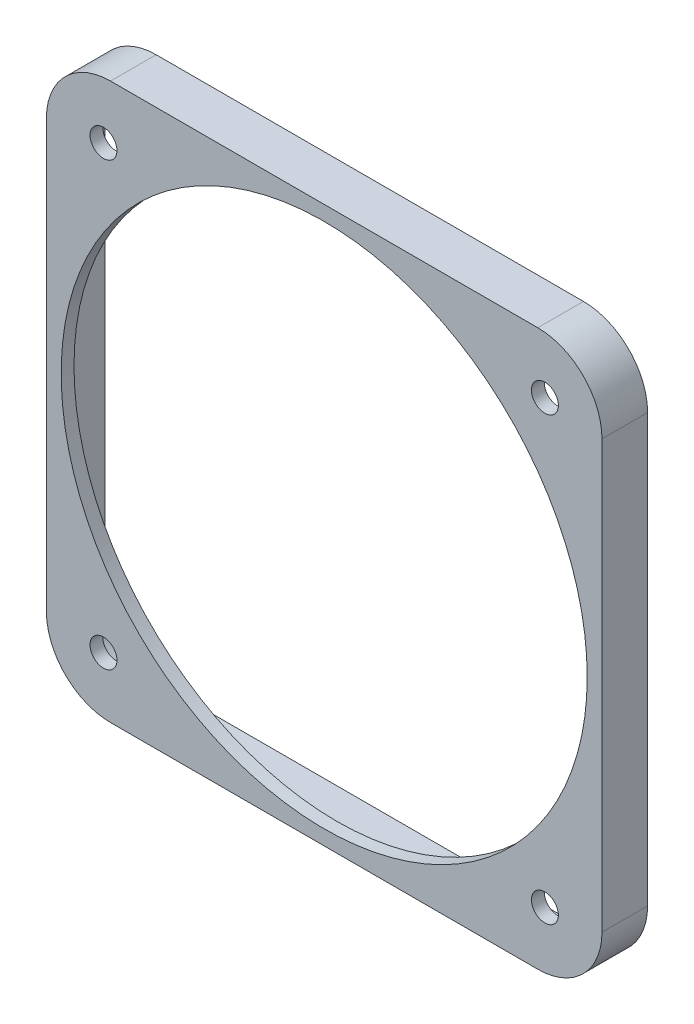
ISO-10303-21;
HEADER;
FILE_DESCRIPTION(('STEP AP214'),'2;1');
FILE_NAME('part.step','',(''),(''),'','','');
FILE_SCHEMA(('AUTOMOTIVE_DESIGN { 1 0 10303 214 1 1 1 1 }'));
ENDSEC;
DATA;
#1=APPLICATION_CONTEXT('core data for automotive mechanical design processes');
#2=APPLICATION_PROTOCOL_DEFINITION('international standard','automotive_design',2000,#1);
#3=PRODUCT_CONTEXT('',#1,'mechanical');
#4=PRODUCT('Part','Part','',(#3));
#5=PRODUCT_RELATED_PRODUCT_CATEGORY('part','',(#4));
#6=PRODUCT_DEFINITION_FORMATION('','',#4);
#7=PRODUCT_DEFINITION_CONTEXT('part definition',#1,'design');
#8=PRODUCT_DEFINITION('design','',#6,#7);
#9=PRODUCT_DEFINITION_SHAPE('','',#8);
#10=(LENGTH_UNIT() NAMED_UNIT(*) SI_UNIT(.MILLI.,.METRE.));
#11=(NAMED_UNIT(*) PLANE_ANGLE_UNIT() SI_UNIT($,.RADIAN.));
#12=(NAMED_UNIT(*) SI_UNIT($,.STERADIAN.) SOLID_ANGLE_UNIT());
#13=UNCERTAINTY_MEASURE_WITH_UNIT(LENGTH_MEASURE(1.E-05),#10,'distance_accuracy_value','');
#14=(GEOMETRIC_REPRESENTATION_CONTEXT(3) GLOBAL_UNCERTAINTY_ASSIGNED_CONTEXT((#13)) GLOBAL_UNIT_ASSIGNED_CONTEXT((#10,
#11,#12)) REPRESENTATION_CONTEXT('',''));
#15=CARTESIAN_POINT('',(0.,0.,0.));
#16=DIRECTION('',(0.,0.,1.));
#17=DIRECTION('',(1.,0.,0.));
#18=AXIS2_PLACEMENT_3D('',#15,#16,#17);
#19=CARTESIAN_POINT('',(0.,0.,0.));
#20=DIRECTION('',(0.,0.,-1.));
#21=DIRECTION('',(-1.,0.,0.));
#22=AXIS2_PLACEMENT_3D('',#19,#20,#21);
#23=PLANE('',#22);
#24=DIRECTION('',(0.,1.,0.));
#25=VECTOR('',#24,1.);
#26=CARTESIAN_POINT('',(54.991,-54.991,0.));
#27=LINE('',#26,#25);
#28=CARTESIAN_POINT('',(54.991,-42.291,0.));
#29=VERTEX_POINT('',#28);
#30=CARTESIAN_POINT('',(54.991,42.291,0.));
#31=VERTEX_POINT('',#30);
#32=EDGE_CURVE('E198',#29,#31,#27,.T.);
#33=ORIENTED_EDGE('',*,*,#32,.F.);
#34=CARTESIAN_POINT('',(42.291,-42.291,0.));
#35=DIRECTION('',(0.,0.,-1.));
#36=DIRECTION('',(-1.,0.,0.));
#37=AXIS2_PLACEMENT_3D('',#34,#35,#36);
#38=CIRCLE('',#37,12.7);
#39=CARTESIAN_POINT('',(42.291,-54.991,0.));
#40=VERTEX_POINT('',#39);
#41=EDGE_CURVE('E253',#29,#40,#38,.T.);
#42=ORIENTED_EDGE('',*,*,#41,.T.);
#43=DIRECTION('',(1.,0.,0.));
#44=VECTOR('',#43,1.);
#45=CARTESIAN_POINT('',(-54.991,-54.991,0.));
#46=LINE('',#45,#44);
#47=CARTESIAN_POINT('',(-42.291,-54.991,0.));
#48=VERTEX_POINT('',#47);
#49=EDGE_CURVE('E225',#48,#40,#46,.T.);
#50=ORIENTED_EDGE('',*,*,#49,.F.);
#51=CARTESIAN_POINT('',(-42.291,-42.291,0.));
#52=DIRECTION('',(0.,0.,-1.));
#53=DIRECTION('',(-1.,0.,0.));
#54=AXIS2_PLACEMENT_3D('',#51,#52,#53);
#55=CIRCLE('',#54,12.7);
#56=CARTESIAN_POINT('',(-54.991,-42.291,0.));
#57=VERTEX_POINT('',#56);
#58=EDGE_CURVE('E251',#48,#57,#55,.T.);
#59=ORIENTED_EDGE('',*,*,#58,.T.);
#60=DIRECTION('',(0.,-1.,0.));
#61=VECTOR('',#60,1.);
#62=CARTESIAN_POINT('',(-54.991,-54.991,0.));
#63=LINE('',#62,#61);
#64=CARTESIAN_POINT('',(-54.991,42.291,0.));
#65=VERTEX_POINT('',#64);
#66=EDGE_CURVE('E239',#65,#57,#63,.T.);
#67=ORIENTED_EDGE('',*,*,#66,.F.);
#68=CARTESIAN_POINT('',(-42.291,42.291,0.));
#69=DIRECTION('',(0.,0.,-1.));
#70=DIRECTION('',(-1.,0.,0.));
#71=AXIS2_PLACEMENT_3D('',#68,#69,#70);
#72=CIRCLE('',#71,12.7);
#73=CARTESIAN_POINT('',(-42.291,54.991,0.));
#74=VERTEX_POINT('',#73);
#75=EDGE_CURVE('E249',#65,#74,#72,.T.);
#76=ORIENTED_EDGE('',*,*,#75,.T.);
#77=DIRECTION('',(-1.,0.,0.));
#78=VECTOR('',#77,1.);
#79=CARTESIAN_POINT('',(-54.991,54.991,0.));
#80=LINE('',#79,#78);
#81=CARTESIAN_POINT('',(42.291,54.991,0.));
#82=VERTEX_POINT('',#81);
#83=EDGE_CURVE('E236',#82,#74,#80,.T.);
#84=ORIENTED_EDGE('',*,*,#83,.F.);
#85=CARTESIAN_POINT('',(42.291,42.291,0.));
#86=DIRECTION('',(0.,0.,-1.));
#87=DIRECTION('',(-1.,0.,0.));
#88=AXIS2_PLACEMENT_3D('',#85,#86,#87);
#89=CIRCLE('',#88,12.7);
#90=EDGE_CURVE('E247',#82,#31,#89,.T.);
#91=ORIENTED_EDGE('',*,*,#90,.T.);
#92=EDGE_LOOP('',(#33,#42,#50,#59,#67,#76,#84,#91));
#93=FACE_BOUND('',#92,.T.);
#94=CARTESIAN_POINT('',(42.291,-42.291,0.));
#95=DIRECTION('',(0.,0.,-1.));
#96=DIRECTION('',(-1.,0.,0.));
#97=AXIS2_PLACEMENT_3D('',#94,#95,#96);
#98=CIRCLE('',#97,10.16);
#99=CARTESIAN_POINT('',(52.451,-42.291,0.));
#100=VERTEX_POINT('',#99);
#101=CARTESIAN_POINT('',(42.291,-52.451,0.));
#102=VERTEX_POINT('',#101);
#103=EDGE_CURVE('E205',#100,#102,#98,.T.);
#104=ORIENTED_EDGE('',*,*,#103,.F.);
#105=DIRECTION('',(0.,1.,0.));
#106=VECTOR('',#105,1.);
#107=CARTESIAN_POINT('',(52.451,0.,0.));
#108=LINE('',#107,#106);
#109=CARTESIAN_POINT('',(52.451,42.291,0.));
#110=VERTEX_POINT('',#109);
#111=EDGE_CURVE('E207',#100,#110,#108,.T.);
#112=ORIENTED_EDGE('',*,*,#111,.T.);
#113=CARTESIAN_POINT('',(42.291,42.291,0.));
#114=DIRECTION('',(0.,0.,-1.));
#115=DIRECTION('',(-1.,0.,0.));
#116=AXIS2_PLACEMENT_3D('',#113,#114,#115);
#117=CIRCLE('',#116,10.16);
#118=CARTESIAN_POINT('',(42.291,52.451,0.));
#119=VERTEX_POINT('',#118);
#120=EDGE_CURVE('E160',#119,#110,#117,.T.);
#121=ORIENTED_EDGE('',*,*,#120,.F.);
#122=DIRECTION('',(-1.,0.,0.));
#123=VECTOR('',#122,1.);
#124=CARTESIAN_POINT('',(0.,52.451,0.));
#125=LINE('',#124,#123);
#126=CARTESIAN_POINT('',(-42.291,52.451,0.));
#127=VERTEX_POINT('',#126);
#128=EDGE_CURVE('E53',#119,#127,#125,.T.);
#129=ORIENTED_EDGE('',*,*,#128,.T.);
#130=CARTESIAN_POINT('',(-42.291,42.291,0.));
#131=DIRECTION('',(0.,0.,-1.));
#132=DIRECTION('',(-1.,0.,0.));
#133=AXIS2_PLACEMENT_3D('',#130,#131,#132);
#134=CIRCLE('',#133,10.16);
#135=CARTESIAN_POINT('',(-52.451,42.291,0.));
#136=VERTEX_POINT('',#135);
#137=EDGE_CURVE('E215',#136,#127,#134,.T.);
#138=ORIENTED_EDGE('',*,*,#137,.F.);
#139=DIRECTION('',(0.,-1.,0.));
#140=VECTOR('',#139,1.);
#141=CARTESIAN_POINT('',(-52.451,0.,0.));
#142=LINE('',#141,#140);
#143=CARTESIAN_POINT('',(-52.451,-42.291,0.));
#144=VERTEX_POINT('',#143);
#145=EDGE_CURVE('E213',#136,#144,#142,.T.);
#146=ORIENTED_EDGE('',*,*,#145,.T.);
#147=CARTESIAN_POINT('',(-42.291,-42.291,0.));
#148=DIRECTION('',(0.,0.,-1.));
#149=DIRECTION('',(-1.,0.,0.));
#150=AXIS2_PLACEMENT_3D('',#147,#148,#149);
#151=CIRCLE('',#150,10.16);
#152=CARTESIAN_POINT('',(-42.291,-52.451,0.));
#153=VERTEX_POINT('',#152);
#154=EDGE_CURVE('E210',#153,#144,#151,.T.);
#155=ORIENTED_EDGE('',*,*,#154,.F.);
#156=DIRECTION('',(1.,0.,0.));
#157=VECTOR('',#156,1.);
#158=CARTESIAN_POINT('',(0.,-52.451,0.));
#159=LINE('',#158,#157);
#160=EDGE_CURVE('E174',#153,#102,#159,.T.);
#161=ORIENTED_EDGE('',*,*,#160,.T.);
#162=EDGE_LOOP('',(#104,#112,#121,#129,#138,#146,#155,#161));
#163=FACE_BOUND('',#162,.T.);
#164=ADVANCED_FACE('F36',(#93,#163),#23,.T.);
#165=CARTESIAN_POINT('',(54.991,-54.991,9.0297));
#166=DIRECTION('',(-1.,0.,0.));
#167=DIRECTION('',(0.,0.,1.));
#168=AXIS2_PLACEMENT_3D('',#165,#166,#167);
#169=PLANE('',#168);
#170=DIRECTION('',(0.,1.,0.));
#171=VECTOR('',#170,1.);
#172=CARTESIAN_POINT('',(54.991,-54.991,9.0297));
#173=LINE('',#172,#171);
#174=CARTESIAN_POINT('',(54.991,-42.291,9.0297));
#175=VERTEX_POINT('',#174);
#176=CARTESIAN_POINT('',(54.991,42.291,9.0297));
#177=VERTEX_POINT('',#176);
#178=EDGE_CURVE('E221',#175,#177,#173,.T.);
#179=ORIENTED_EDGE('',*,*,#178,.F.);
#180=DIRECTION('',(0.,0.,-1.));
#181=VECTOR('',#180,1.);
#182=CARTESIAN_POINT('',(54.991,-42.291,9.0297));
#183=LINE('',#182,#181);
#184=EDGE_CURVE('E244',#175,#29,#183,.T.);
#185=ORIENTED_EDGE('',*,*,#184,.T.);
#186=ORIENTED_EDGE('',*,*,#32,.T.);
#187=DIRECTION('',(0.,0.,-1.));
#188=VECTOR('',#187,1.);
#189=CARTESIAN_POINT('',(54.991,42.291,9.0297));
#190=LINE('',#189,#188);
#191=EDGE_CURVE('E233',#31,#177,#190,.F.);
#192=ORIENTED_EDGE('',*,*,#191,.T.);
#193=EDGE_LOOP('',(#179,#185,#186,#192));
#194=FACE_BOUND('',#193,.T.);
#195=ADVANCED_FACE('F353',(#194),#169,.F.);
#196=CARTESIAN_POINT('',(-54.991,54.991,9.0297));
#197=DIRECTION('',(0.,-1.,0.));
#198=DIRECTION('',(0.,0.,-1.));
#199=AXIS2_PLACEMENT_3D('',#196,#197,#198);
#200=PLANE('',#199);
#201=ORIENTED_EDGE('',*,*,#83,.T.);
#202=DIRECTION('',(0.,0.,-1.));
#203=VECTOR('',#202,1.);
#204=CARTESIAN_POINT('',(-42.291,54.991,9.0297));
#205=LINE('',#204,#203);
#206=CARTESIAN_POINT('',(-42.291,54.991,9.0297));
#207=VERTEX_POINT('',#206);
#208=EDGE_CURVE('E11',#74,#207,#205,.F.);
#209=ORIENTED_EDGE('',*,*,#208,.T.);
#210=DIRECTION('',(-1.,0.,0.));
#211=VECTOR('',#210,1.);
#212=CARTESIAN_POINT('',(-54.991,54.991,9.0297));
#213=LINE('',#212,#211);
#214=CARTESIAN_POINT('',(42.291,54.991,9.0297));
#215=VERTEX_POINT('',#214);
#216=EDGE_CURVE('E224',#215,#207,#213,.T.);
#217=ORIENTED_EDGE('',*,*,#216,.F.);
#218=DIRECTION('',(0.,0.,-1.));
#219=VECTOR('',#218,1.);
#220=CARTESIAN_POINT('',(42.291,54.991,9.0297));
#221=LINE('',#220,#219);
#222=EDGE_CURVE('E45',#215,#82,#221,.T.);
#223=ORIENTED_EDGE('',*,*,#222,.T.);
#224=EDGE_LOOP('',(#201,#209,#217,#223));
#225=FACE_BOUND('',#224,.T.);
#226=ADVANCED_FACE('F359',(#225),#200,.F.);
#227=CARTESIAN_POINT('',(-54.991,-54.991,9.0297));
#228=DIRECTION('',(1.,0.,0.));
#229=DIRECTION('',(0.,0.,-1.));
#230=AXIS2_PLACEMENT_3D('',#227,#228,#229);
#231=PLANE('',#230);
#232=ORIENTED_EDGE('',*,*,#66,.T.);
#233=DIRECTION('',(0.,0.,-1.));
#234=VECTOR('',#233,1.);
#235=CARTESIAN_POINT('',(-54.991,-42.291,9.0297));
#236=LINE('',#235,#234);
#237=CARTESIAN_POINT('',(-54.991,-42.291,9.0297));
#238=VERTEX_POINT('',#237);
#239=EDGE_CURVE('E61',#57,#238,#236,.F.);
#240=ORIENTED_EDGE('',*,*,#239,.T.);
#241=DIRECTION('',(0.,-1.,0.));
#242=VECTOR('',#241,1.);
#243=CARTESIAN_POINT('',(-54.991,-54.991,9.0297));
#244=LINE('',#243,#242);
#245=CARTESIAN_POINT('',(-54.991,42.291,9.0297));
#246=VERTEX_POINT('',#245);
#247=EDGE_CURVE('E228',#246,#238,#244,.T.);
#248=ORIENTED_EDGE('',*,*,#247,.F.);
#249=DIRECTION('',(0.,0.,-1.));
#250=VECTOR('',#249,1.);
#251=CARTESIAN_POINT('',(-54.991,42.291,9.0297));
#252=LINE('',#251,#250);
#253=EDGE_CURVE('E268',#246,#65,#252,.T.);
#254=ORIENTED_EDGE('',*,*,#253,.T.);
#255=EDGE_LOOP('',(#232,#240,#248,#254));
#256=FACE_BOUND('',#255,.T.);
#257=ADVANCED_FACE('F370',(#256),#231,.F.);
#258=CARTESIAN_POINT('',(-54.991,-54.991,9.0297));
#259=DIRECTION('',(0.,1.,0.));
#260=DIRECTION('',(0.,0.,1.));
#261=AXIS2_PLACEMENT_3D('',#258,#259,#260);
#262=PLANE('',#261);
#263=ORIENTED_EDGE('',*,*,#49,.T.);
#264=DIRECTION('',(0.,0.,-1.));
#265=VECTOR('',#264,1.);
#266=CARTESIAN_POINT('',(42.291,-54.991,9.0297));
#267=LINE('',#266,#265);
#268=CARTESIAN_POINT('',(42.291,-54.991,9.0297));
#269=VERTEX_POINT('',#268);
#270=EDGE_CURVE('E258',#40,#269,#267,.F.);
#271=ORIENTED_EDGE('',*,*,#270,.T.);
#272=DIRECTION('',(1.,0.,0.));
#273=VECTOR('',#272,1.);
#274=CARTESIAN_POINT('',(-54.991,-54.991,9.0297));
#275=LINE('',#274,#273);
#276=CARTESIAN_POINT('',(-42.291,-54.991,9.0297));
#277=VERTEX_POINT('',#276);
#278=EDGE_CURVE('E230',#277,#269,#275,.T.);
#279=ORIENTED_EDGE('',*,*,#278,.F.);
#280=DIRECTION('',(0.,0.,-1.));
#281=VECTOR('',#280,1.);
#282=CARTESIAN_POINT('',(-42.291,-54.991,9.0297));
#283=LINE('',#282,#281);
#284=EDGE_CURVE('E255',#277,#48,#283,.T.);
#285=ORIENTED_EDGE('',*,*,#284,.T.);
#286=EDGE_LOOP('',(#263,#271,#279,#285));
#287=FACE_BOUND('',#286,.T.);
#288=ADVANCED_FACE('F367',(#287),#262,.F.);
#289=CARTESIAN_POINT('',(0.,0.,9.0297));
#290=DIRECTION('',(0.,0.,-1.));
#291=DIRECTION('',(-1.,0.,0.));
#292=AXIS2_PLACEMENT_3D('',#289,#290,#291);
#293=PLANE('',#292);
#294=CARTESIAN_POINT('',(43.688,-43.688,9.0297));
#295=DIRECTION('',(0.,0.,1.));
#296=DIRECTION('',(1.,0.,0.));
#297=AXIS2_PLACEMENT_3D('',#294,#295,#296);
#298=CIRCLE('',#297,2.667);
#299=CARTESIAN_POINT('',(46.355,-43.688,9.0297));
#300=VERTEX_POINT('',#299);
#301=EDGE_CURVE('E319',#300,#300,#298,.T.);
#302=ORIENTED_EDGE('',*,*,#301,.F.);
#303=EDGE_LOOP('',(#302));
#304=FACE_BOUND('',#303,.T.);
#305=CARTESIAN_POINT('',(-43.688,-43.688,9.0297));
#306=DIRECTION('',(0.,0.,1.));
#307=DIRECTION('',(1.,0.,0.));
#308=AXIS2_PLACEMENT_3D('',#305,#306,#307);
#309=CIRCLE('',#308,2.667);
#310=CARTESIAN_POINT('',(-41.021,-43.688,9.0297));
#311=VERTEX_POINT('',#310);
#312=EDGE_CURVE('E419',#311,#311,#309,.T.);
#313=ORIENTED_EDGE('',*,*,#312,.F.);
#314=EDGE_LOOP('',(#313));
#315=FACE_BOUND('',#314,.T.);
#316=CARTESIAN_POINT('',(-43.688,43.688,9.0297));
#317=DIRECTION('',(0.,0.,1.));
#318=DIRECTION('',(1.,0.,0.));
#319=AXIS2_PLACEMENT_3D('',#316,#317,#318);
#320=CIRCLE('',#319,2.667);
#321=CARTESIAN_POINT('',(-41.021,43.688,9.0297));
#322=VERTEX_POINT('',#321);
#323=EDGE_CURVE('E316',#322,#322,#320,.T.);
#324=ORIENTED_EDGE('',*,*,#323,.F.);
#325=EDGE_LOOP('',(#324));
#326=FACE_BOUND('',#325,.T.);
#327=CARTESIAN_POINT('',(43.688,43.688,9.0297));
#328=DIRECTION('',(0.,0.,1.));
#329=DIRECTION('',(1.,0.,0.));
#330=AXIS2_PLACEMENT_3D('',#327,#328,#329);
#331=CIRCLE('',#330,2.667);
#332=CARTESIAN_POINT('',(46.355,43.688,9.0297));
#333=VERTEX_POINT('',#332);
#334=EDGE_CURVE('E313',#333,#333,#331,.T.);
#335=ORIENTED_EDGE('',*,*,#334,.F.);
#336=EDGE_LOOP('',(#335));
#337=FACE_BOUND('',#336,.T.);
#338=CARTESIAN_POINT('',(0.,0.,9.0297));
#339=DIRECTION('',(0.,0.,1.));
#340=DIRECTION('',(1.,0.,0.));
#341=AXIS2_PLACEMENT_3D('',#338,#339,#340);
#342=CIRCLE('',#341,52.07);
#343=CARTESIAN_POINT('',(52.07,0.,9.0297));
#344=VERTEX_POINT('',#343);
#345=EDGE_CURVE('E278',#344,#344,#342,.T.);
#346=ORIENTED_EDGE('',*,*,#345,.F.);
#347=EDGE_LOOP('',(#346));
#348=FACE_BOUND('',#347,.T.);
#349=ORIENTED_EDGE('',*,*,#278,.T.);
#350=CARTESIAN_POINT('',(42.291,-42.291,9.0297));
#351=DIRECTION('',(0.,0.,-1.));
#352=DIRECTION('',(-1.,0.,0.));
#353=AXIS2_PLACEMENT_3D('',#350,#351,#352);
#354=CIRCLE('',#353,12.7);
#355=EDGE_CURVE('E266',#269,#175,#354,.F.);
#356=ORIENTED_EDGE('',*,*,#355,.T.);
#357=ORIENTED_EDGE('',*,*,#178,.T.);
#358=CARTESIAN_POINT('',(42.291,42.291,9.0297));
#359=DIRECTION('',(0.,0.,-1.));
#360=DIRECTION('',(-1.,0.,0.));
#361=AXIS2_PLACEMENT_3D('',#358,#359,#360);
#362=CIRCLE('',#361,12.7);
#363=EDGE_CURVE('E260',#177,#215,#362,.F.);
#364=ORIENTED_EDGE('',*,*,#363,.T.);
#365=ORIENTED_EDGE('',*,*,#216,.T.);
#366=CARTESIAN_POINT('',(-42.291,42.291,9.0297));
#367=DIRECTION('',(0.,0.,-1.));
#368=DIRECTION('',(-1.,0.,0.));
#369=AXIS2_PLACEMENT_3D('',#366,#367,#368);
#370=CIRCLE('',#369,12.7);
#371=EDGE_CURVE('E262',#207,#246,#370,.F.);
#372=ORIENTED_EDGE('',*,*,#371,.T.);
#373=ORIENTED_EDGE('',*,*,#247,.T.);
#374=CARTESIAN_POINT('',(-42.291,-42.291,9.0297));
#375=DIRECTION('',(0.,0.,-1.));
#376=DIRECTION('',(-1.,0.,0.));
#377=AXIS2_PLACEMENT_3D('',#374,#375,#376);
#378=CIRCLE('',#377,12.7);
#379=EDGE_CURVE('E264',#238,#277,#378,.F.);
#380=ORIENTED_EDGE('',*,*,#379,.T.);
#381=EDGE_LOOP('',(#349,#356,#357,#364,#365,#372,#373,#380));
#382=FACE_BOUND('',#381,.T.);
#383=ADVANCED_FACE('F365',(#304,#315,#326,#337,#348,#382),#293,.F.);
#384=CARTESIAN_POINT('',(42.291,-42.291,9.0297));
#385=DIRECTION('',(0.,0.,-1.));
#386=DIRECTION('',(-1.,0.,0.));
#387=AXIS2_PLACEMENT_3D('',#384,#385,#386);
#388=CYLINDRICAL_SURFACE('',#387,12.7);
#389=ORIENTED_EDGE('',*,*,#355,.F.);
#390=ORIENTED_EDGE('',*,*,#270,.F.);
#391=ORIENTED_EDGE('',*,*,#41,.F.);
#392=ORIENTED_EDGE('',*,*,#184,.F.);
#393=EDGE_LOOP('',(#389,#390,#391,#392));
#394=FACE_BOUND('',#393,.T.);
#395=ADVANCED_FACE('F377',(#394),#388,.T.);
#396=CARTESIAN_POINT('',(-42.291,-42.291,9.0297));
#397=DIRECTION('',(0.,0.,-1.));
#398=DIRECTION('',(-1.,0.,0.));
#399=AXIS2_PLACEMENT_3D('',#396,#397,#398);
#400=CYLINDRICAL_SURFACE('',#399,12.7);
#401=ORIENTED_EDGE('',*,*,#379,.F.);
#402=ORIENTED_EDGE('',*,*,#239,.F.);
#403=ORIENTED_EDGE('',*,*,#58,.F.);
#404=ORIENTED_EDGE('',*,*,#284,.F.);
#405=EDGE_LOOP('',(#401,#402,#403,#404));
#406=FACE_BOUND('',#405,.T.);
#407=ADVANCED_FACE('F380',(#406),#400,.T.);
#408=CARTESIAN_POINT('',(-42.291,42.291,9.0297));
#409=DIRECTION('',(0.,0.,-1.));
#410=DIRECTION('',(-1.,0.,0.));
#411=AXIS2_PLACEMENT_3D('',#408,#409,#410);
#412=CYLINDRICAL_SURFACE('',#411,12.7);
#413=ORIENTED_EDGE('',*,*,#371,.F.);
#414=ORIENTED_EDGE('',*,*,#208,.F.);
#415=ORIENTED_EDGE('',*,*,#75,.F.);
#416=ORIENTED_EDGE('',*,*,#253,.F.);
#417=EDGE_LOOP('',(#413,#414,#415,#416));
#418=FACE_BOUND('',#417,.T.);
#419=ADVANCED_FACE('F383',(#418),#412,.T.);
#420=CARTESIAN_POINT('',(42.291,42.291,9.0297));
#421=DIRECTION('',(0.,0.,-1.));
#422=DIRECTION('',(-1.,0.,0.));
#423=AXIS2_PLACEMENT_3D('',#420,#421,#422);
#424=CYLINDRICAL_SURFACE('',#423,12.7);
#425=ORIENTED_EDGE('',*,*,#363,.F.);
#426=ORIENTED_EDGE('',*,*,#191,.F.);
#427=ORIENTED_EDGE('',*,*,#90,.F.);
#428=ORIENTED_EDGE('',*,*,#222,.F.);
#429=EDGE_LOOP('',(#425,#426,#427,#428));
#430=FACE_BOUND('',#429,.T.);
#431=ADVANCED_FACE('F38',(#430),#424,.T.);
#432=CARTESIAN_POINT('',(52.451,-54.991,9.0297));
#433=DIRECTION('',(-1.,0.,0.));
#434=DIRECTION('',(0.,0.,1.));
#435=AXIS2_PLACEMENT_3D('',#432,#433,#434);
#436=PLANE('',#435);
#437=DIRECTION('',(0.,1.,0.));
#438=VECTOR('',#437,1.);
#439=CARTESIAN_POINT('',(52.451,0.,6.4897));
#440=LINE('',#439,#438);
#441=CARTESIAN_POINT('',(52.451,-42.291,6.4897));
#442=VERTEX_POINT('',#441);
#443=CARTESIAN_POINT('',(52.451,42.291,6.4897));
#444=VERTEX_POINT('',#443);
#445=EDGE_CURVE('E169',#442,#444,#440,.T.);
#446=ORIENTED_EDGE('',*,*,#445,.T.);
#447=DIRECTION('',(0.,0.,1.));
#448=VECTOR('',#447,1.);
#449=CARTESIAN_POINT('',(52.451,42.291,9.0297));
#450=LINE('',#449,#448);
#451=EDGE_CURVE('E153',#110,#444,#450,.T.);
#452=ORIENTED_EDGE('',*,*,#451,.F.);
#453=ORIENTED_EDGE('',*,*,#111,.F.);
#454=DIRECTION('',(0.,0.,1.));
#455=VECTOR('',#454,1.);
#456=CARTESIAN_POINT('',(52.451,-42.291,9.0297));
#457=LINE('',#456,#455);
#458=EDGE_CURVE('E164',#442,#100,#457,.F.);
#459=ORIENTED_EDGE('',*,*,#458,.F.);
#460=EDGE_LOOP('',(#446,#452,#453,#459));
#461=FACE_BOUND('',#460,.T.);
#462=ADVANCED_FACE('F170',(#461),#436,.T.);
#463=CARTESIAN_POINT('',(-54.991,52.451,9.0297));
#464=DIRECTION('',(0.,-1.,0.));
#465=DIRECTION('',(0.,0.,-1.));
#466=AXIS2_PLACEMENT_3D('',#463,#464,#465);
#467=PLANE('',#466);
#468=ORIENTED_EDGE('',*,*,#128,.F.);
#469=DIRECTION('',(0.,0.,-1.));
#470=VECTOR('',#469,1.);
#471=CARTESIAN_POINT('',(42.291,52.451,9.0297));
#472=LINE('',#471,#470);
#473=CARTESIAN_POINT('',(42.291,52.451,6.4897));
#474=VERTEX_POINT('',#473);
#475=EDGE_CURVE('E199',#474,#119,#472,.T.);
#476=ORIENTED_EDGE('',*,*,#475,.F.);
#477=DIRECTION('',(-1.,0.,0.));
#478=VECTOR('',#477,1.);
#479=CARTESIAN_POINT('',(0.,52.451,6.4897));
#480=LINE('',#479,#478);
#481=CARTESIAN_POINT('',(-42.291,52.451,6.4897));
#482=VERTEX_POINT('',#481);
#483=EDGE_CURVE('E173',#474,#482,#480,.T.);
#484=ORIENTED_EDGE('',*,*,#483,.T.);
#485=DIRECTION('',(0.,0.,-1.));
#486=VECTOR('',#485,1.);
#487=CARTESIAN_POINT('',(-42.291,52.451,9.0297));
#488=LINE('',#487,#486);
#489=EDGE_CURVE('E196',#127,#482,#488,.F.);
#490=ORIENTED_EDGE('',*,*,#489,.F.);
#491=EDGE_LOOP('',(#468,#476,#484,#490));
#492=FACE_BOUND('',#491,.T.);
#493=ADVANCED_FACE('F343',(#492),#467,.T.);
#494=CARTESIAN_POINT('',(-52.451,-54.991,9.0297));
#495=DIRECTION('',(1.,0.,0.));
#496=DIRECTION('',(0.,0.,-1.));
#497=AXIS2_PLACEMENT_3D('',#494,#495,#496);
#498=PLANE('',#497);
#499=ORIENTED_EDGE('',*,*,#145,.F.);
#500=DIRECTION('',(0.,0.,-1.));
#501=VECTOR('',#500,1.);
#502=CARTESIAN_POINT('',(-52.451,42.291,9.0297));
#503=LINE('',#502,#501);
#504=CARTESIAN_POINT('',(-52.451,42.291,6.4897));
#505=VERTEX_POINT('',#504);
#506=EDGE_CURVE('E202',#505,#136,#503,.T.);
#507=ORIENTED_EDGE('',*,*,#506,.F.);
#508=DIRECTION('',(0.,-1.,0.));
#509=VECTOR('',#508,1.);
#510=CARTESIAN_POINT('',(-52.451,0.,6.4897));
#511=LINE('',#510,#509);
#512=CARTESIAN_POINT('',(-52.451,-42.291,6.4897));
#513=VERTEX_POINT('',#512);
#514=EDGE_CURVE('E191',#505,#513,#511,.T.);
#515=ORIENTED_EDGE('',*,*,#514,.T.);
#516=DIRECTION('',(0.,0.,-1.));
#517=VECTOR('',#516,1.);
#518=CARTESIAN_POINT('',(-52.451,-42.291,9.0297));
#519=LINE('',#518,#517);
#520=EDGE_CURVE('E201',#144,#513,#519,.F.);
#521=ORIENTED_EDGE('',*,*,#520,.F.);
#522=EDGE_LOOP('',(#499,#507,#515,#521));
#523=FACE_BOUND('',#522,.T.);
#524=ADVANCED_FACE('F338',(#523),#498,.T.);
#525=CARTESIAN_POINT('',(-54.991,-52.451,9.0297));
#526=DIRECTION('',(0.,1.,0.));
#527=DIRECTION('',(0.,0.,1.));
#528=AXIS2_PLACEMENT_3D('',#525,#526,#527);
#529=PLANE('',#528);
#530=ORIENTED_EDGE('',*,*,#160,.F.);
#531=DIRECTION('',(0.,0.,1.));
#532=VECTOR('',#531,1.);
#533=CARTESIAN_POINT('',(-42.291,-52.451,9.0297));
#534=LINE('',#533,#532);
#535=CARTESIAN_POINT('',(-42.291,-52.451,6.4897));
#536=VERTEX_POINT('',#535);
#537=EDGE_CURVE('E185',#536,#153,#534,.F.);
#538=ORIENTED_EDGE('',*,*,#537,.F.);
#539=DIRECTION('',(1.,0.,0.));
#540=VECTOR('',#539,1.);
#541=CARTESIAN_POINT('',(0.,-52.451,6.4897));
#542=LINE('',#541,#540);
#543=CARTESIAN_POINT('',(42.291,-52.451,6.4897));
#544=VERTEX_POINT('',#543);
#545=EDGE_CURVE('E165',#536,#544,#542,.T.);
#546=ORIENTED_EDGE('',*,*,#545,.T.);
#547=DIRECTION('',(0.,0.,1.));
#548=VECTOR('',#547,1.);
#549=CARTESIAN_POINT('',(42.291,-52.451,9.0297));
#550=LINE('',#549,#548);
#551=EDGE_CURVE('E181',#102,#544,#550,.T.);
#552=ORIENTED_EDGE('',*,*,#551,.F.);
#553=EDGE_LOOP('',(#530,#538,#546,#552));
#554=FACE_BOUND('',#553,.T.);
#555=ADVANCED_FACE('F296',(#554),#529,.T.);
#556=CARTESIAN_POINT('',(0.,0.,6.4897));
#557=DIRECTION('',(0.,0.,-1.));
#558=DIRECTION('',(-1.,0.,0.));
#559=AXIS2_PLACEMENT_3D('',#556,#557,#558);
#560=PLANE('',#559);
#561=CARTESIAN_POINT('',(43.688,-43.688,6.4897));
#562=DIRECTION('',(0.,0.,-1.));
#563=DIRECTION('',(-1.,0.,0.));
#564=AXIS2_PLACEMENT_3D('',#561,#562,#563);
#565=CIRCLE('',#564,2.667);
#566=CARTESIAN_POINT('',(41.021,-43.688,6.4897));
#567=VERTEX_POINT('',#566);
#568=EDGE_CURVE('E40',#567,#567,#565,.T.);
#569=ORIENTED_EDGE('',*,*,#568,.F.);
#570=EDGE_LOOP('',(#569));
#571=FACE_BOUND('',#570,.T.);
#572=CARTESIAN_POINT('',(-43.688,-43.688,6.4897));
#573=DIRECTION('',(0.,0.,-1.));
#574=DIRECTION('',(-1.,0.,0.));
#575=AXIS2_PLACEMENT_3D('',#572,#573,#574);
#576=CIRCLE('',#575,2.667);
#577=CARTESIAN_POINT('',(-46.355,-43.688,6.4897));
#578=VERTEX_POINT('',#577);
#579=EDGE_CURVE('E283',#578,#578,#576,.T.);
#580=ORIENTED_EDGE('',*,*,#579,.F.);
#581=EDGE_LOOP('',(#580));
#582=FACE_BOUND('',#581,.T.);
#583=CARTESIAN_POINT('',(-43.688,43.688,6.4897));
#584=DIRECTION('',(0.,0.,-1.));
#585=DIRECTION('',(-1.,0.,0.));
#586=AXIS2_PLACEMENT_3D('',#583,#584,#585);
#587=CIRCLE('',#586,2.667);
#588=CARTESIAN_POINT('',(-46.355,43.688,6.4897));
#589=VERTEX_POINT('',#588);
#590=EDGE_CURVE('E281',#589,#589,#587,.T.);
#591=ORIENTED_EDGE('',*,*,#590,.F.);
#592=EDGE_LOOP('',(#591));
#593=FACE_BOUND('',#592,.T.);
#594=CARTESIAN_POINT('',(43.688,43.688,6.4897));
#595=DIRECTION('',(0.,0.,-1.));
#596=DIRECTION('',(-1.,0.,0.));
#597=AXIS2_PLACEMENT_3D('',#594,#595,#596);
#598=CIRCLE('',#597,2.667);
#599=CARTESIAN_POINT('',(41.021,43.688,6.4897));
#600=VERTEX_POINT('',#599);
#601=EDGE_CURVE('E277',#600,#600,#598,.T.);
#602=ORIENTED_EDGE('',*,*,#601,.F.);
#603=EDGE_LOOP('',(#602));
#604=FACE_BOUND('',#603,.T.);
#605=CARTESIAN_POINT('',(0.,0.,6.4897));
#606=DIRECTION('',(0.,0.,-1.));
#607=DIRECTION('',(-1.,0.,0.));
#608=AXIS2_PLACEMENT_3D('',#605,#606,#607);
#609=CIRCLE('',#608,52.07);
#610=CARTESIAN_POINT('',(-52.07,0.,6.4897));
#611=VERTEX_POINT('',#610);
#612=EDGE_CURVE('E274',#611,#611,#609,.T.);
#613=ORIENTED_EDGE('',*,*,#612,.F.);
#614=EDGE_LOOP('',(#613));
#615=FACE_BOUND('',#614,.T.);
#616=ORIENTED_EDGE('',*,*,#545,.F.);
#617=CARTESIAN_POINT('',(-42.291,-42.291,6.4897));
#618=DIRECTION('',(0.,0.,-1.));
#619=DIRECTION('',(-1.,0.,0.));
#620=AXIS2_PLACEMENT_3D('',#617,#618,#619);
#621=CIRCLE('',#620,10.16);
#622=EDGE_CURVE('E183',#513,#536,#621,.F.);
#623=ORIENTED_EDGE('',*,*,#622,.F.);
#624=ORIENTED_EDGE('',*,*,#514,.F.);
#625=CARTESIAN_POINT('',(-42.291,42.291,6.4897));
#626=DIRECTION('',(0.,0.,-1.));
#627=DIRECTION('',(-1.,0.,0.));
#628=AXIS2_PLACEMENT_3D('',#625,#626,#627);
#629=CIRCLE('',#628,10.16);
#630=EDGE_CURVE('E180',#482,#505,#629,.F.);
#631=ORIENTED_EDGE('',*,*,#630,.F.);
#632=ORIENTED_EDGE('',*,*,#483,.F.);
#633=CARTESIAN_POINT('',(42.291,42.291,6.4897));
#634=DIRECTION('',(0.,0.,-1.));
#635=DIRECTION('',(-1.,0.,0.));
#636=AXIS2_PLACEMENT_3D('',#633,#634,#635);
#637=CIRCLE('',#636,10.16);
#638=EDGE_CURVE('E157',#444,#474,#637,.F.);
#639=ORIENTED_EDGE('',*,*,#638,.F.);
#640=ORIENTED_EDGE('',*,*,#445,.F.);
#641=CARTESIAN_POINT('',(42.291,-42.291,6.4897));
#642=DIRECTION('',(0.,0.,-1.));
#643=DIRECTION('',(-1.,0.,0.));
#644=AXIS2_PLACEMENT_3D('',#641,#642,#643);
#645=CIRCLE('',#644,10.16);
#646=EDGE_CURVE('E189',#544,#442,#645,.F.);
#647=ORIENTED_EDGE('',*,*,#646,.F.);
#648=EDGE_LOOP('',(#616,#623,#624,#631,#632,#639,#640,#647));
#649=FACE_BOUND('',#648,.T.);
#650=ADVANCED_FACE('F177',(#571,#582,#593,#604,#615,#649),#560,.T.);
#651=CARTESIAN_POINT('',(42.291,-42.291,9.0297));
#652=DIRECTION('',(0.,0.,-1.));
#653=DIRECTION('',(-1.,0.,0.));
#654=AXIS2_PLACEMENT_3D('',#651,#652,#653);
#655=CYLINDRICAL_SURFACE('',#654,10.16);
#656=ORIENTED_EDGE('',*,*,#646,.T.);
#657=ORIENTED_EDGE('',*,*,#458,.T.);
#658=ORIENTED_EDGE('',*,*,#103,.T.);
#659=ORIENTED_EDGE('',*,*,#551,.T.);
#660=EDGE_LOOP('',(#656,#657,#658,#659));
#661=FACE_BOUND('',#660,.T.);
#662=ADVANCED_FACE('F295',(#661),#655,.F.);
#663=CARTESIAN_POINT('',(-42.291,-42.291,9.0297));
#664=DIRECTION('',(0.,0.,-1.));
#665=DIRECTION('',(-1.,0.,0.));
#666=AXIS2_PLACEMENT_3D('',#663,#664,#665);
#667=CYLINDRICAL_SURFACE('',#666,10.16);
#668=ORIENTED_EDGE('',*,*,#622,.T.);
#669=ORIENTED_EDGE('',*,*,#537,.T.);
#670=ORIENTED_EDGE('',*,*,#154,.T.);
#671=ORIENTED_EDGE('',*,*,#520,.T.);
#672=EDGE_LOOP('',(#668,#669,#670,#671));
#673=FACE_BOUND('',#672,.T.);
#674=ADVANCED_FACE('F336',(#673),#667,.F.);
#675=CARTESIAN_POINT('',(-42.291,42.291,9.0297));
#676=DIRECTION('',(0.,0.,-1.));
#677=DIRECTION('',(-1.,0.,0.));
#678=AXIS2_PLACEMENT_3D('',#675,#676,#677);
#679=CYLINDRICAL_SURFACE('',#678,10.16);
#680=ORIENTED_EDGE('',*,*,#630,.T.);
#681=ORIENTED_EDGE('',*,*,#506,.T.);
#682=ORIENTED_EDGE('',*,*,#137,.T.);
#683=ORIENTED_EDGE('',*,*,#489,.T.);
#684=EDGE_LOOP('',(#680,#681,#682,#683));
#685=FACE_BOUND('',#684,.T.);
#686=ADVANCED_FACE('F342',(#685),#679,.F.);
#687=CARTESIAN_POINT('',(42.291,42.291,9.0297));
#688=DIRECTION('',(0.,0.,-1.));
#689=DIRECTION('',(-1.,0.,0.));
#690=AXIS2_PLACEMENT_3D('',#687,#688,#689);
#691=CYLINDRICAL_SURFACE('',#690,10.16);
#692=ORIENTED_EDGE('',*,*,#638,.T.);
#693=ORIENTED_EDGE('',*,*,#475,.T.);
#694=ORIENTED_EDGE('',*,*,#120,.T.);
#695=ORIENTED_EDGE('',*,*,#451,.T.);
#696=EDGE_LOOP('',(#692,#693,#694,#695));
#697=FACE_BOUND('',#696,.T.);
#698=ADVANCED_FACE('F155',(#697),#691,.F.);
#699=CARTESIAN_POINT('',(0.,0.,0.));
#700=DIRECTION('',(0.,0.,1.));
#701=DIRECTION('',(1.,0.,0.));
#702=AXIS2_PLACEMENT_3D('',#699,#700,#701);
#703=CYLINDRICAL_SURFACE('',#702,52.07);
#704=ORIENTED_EDGE('',*,*,#612,.T.);
#705=EDGE_LOOP('',(#704));
#706=FACE_BOUND('',#705,.T.);
#707=ORIENTED_EDGE('',*,*,#345,.T.);
#708=EDGE_LOOP('',(#707));
#709=FACE_BOUND('',#708,.T.);
#710=ADVANCED_FACE('F305',(#706,#709),#703,.F.);
#711=CARTESIAN_POINT('',(43.688,43.688,0.));
#712=DIRECTION('',(0.,0.,1.));
#713=DIRECTION('',(1.,0.,0.));
#714=AXIS2_PLACEMENT_3D('',#711,#712,#713);
#715=CYLINDRICAL_SURFACE('',#714,2.667);
#716=ORIENTED_EDGE('',*,*,#601,.T.);
#717=EDGE_LOOP('',(#716));
#718=FACE_BOUND('',#717,.T.);
#719=ORIENTED_EDGE('',*,*,#334,.T.);
#720=EDGE_LOOP('',(#719));
#721=FACE_BOUND('',#720,.T.);
#722=ADVANCED_FACE('F308',(#718,#721),#715,.F.);
#723=CARTESIAN_POINT('',(-43.688,43.688,0.));
#724=DIRECTION('',(0.,0.,1.));
#725=DIRECTION('',(1.,0.,0.));
#726=AXIS2_PLACEMENT_3D('',#723,#724,#725);
#727=CYLINDRICAL_SURFACE('',#726,2.667);
#728=ORIENTED_EDGE('',*,*,#590,.T.);
#729=EDGE_LOOP('',(#728));
#730=FACE_BOUND('',#729,.T.);
#731=ORIENTED_EDGE('',*,*,#323,.T.);
#732=EDGE_LOOP('',(#731));
#733=FACE_BOUND('',#732,.T.);
#734=ADVANCED_FACE('F426',(#730,#733),#727,.F.);
#735=CARTESIAN_POINT('',(-43.688,-43.688,0.));
#736=DIRECTION('',(0.,0.,1.));
#737=DIRECTION('',(1.,0.,0.));
#738=AXIS2_PLACEMENT_3D('',#735,#736,#737);
#739=CYLINDRICAL_SURFACE('',#738,2.667);
#740=ORIENTED_EDGE('',*,*,#579,.T.);
#741=EDGE_LOOP('',(#740));
#742=FACE_BOUND('',#741,.T.);
#743=ORIENTED_EDGE('',*,*,#312,.T.);
#744=EDGE_LOOP('',(#743));
#745=FACE_BOUND('',#744,.T.);
#746=ADVANCED_FACE('F432',(#742,#745),#739,.F.);
#747=CARTESIAN_POINT('',(43.688,-43.688,0.));
#748=DIRECTION('',(0.,0.,1.));
#749=DIRECTION('',(1.,0.,0.));
#750=AXIS2_PLACEMENT_3D('',#747,#748,#749);
#751=CYLINDRICAL_SURFACE('',#750,2.667);
#752=ORIENTED_EDGE('',*,*,#568,.T.);
#753=EDGE_LOOP('',(#752));
#754=FACE_BOUND('',#753,.T.);
#755=ORIENTED_EDGE('',*,*,#301,.T.);
#756=EDGE_LOOP('',(#755));
#757=FACE_BOUND('',#756,.T.);
#758=ADVANCED_FACE('F290',(#754,#757),#751,.F.);
#759=CLOSED_SHELL('',(#164,#195,#226,#257,#288,#383,#395,#407,#419,#431,#462,#493,#524,#555,
#650,#662,#674,#686,#698,#710,#722,#734,#746,#758));
#760=MANIFOLD_SOLID_BREP('B2',#759);
#761=ADVANCED_BREP_SHAPE_REPRESENTATION('',(#18,#760),#14);
#762=SHAPE_DEFINITION_REPRESENTATION(#9,#761);
ENDSEC;
END-ISO-10303-21;
